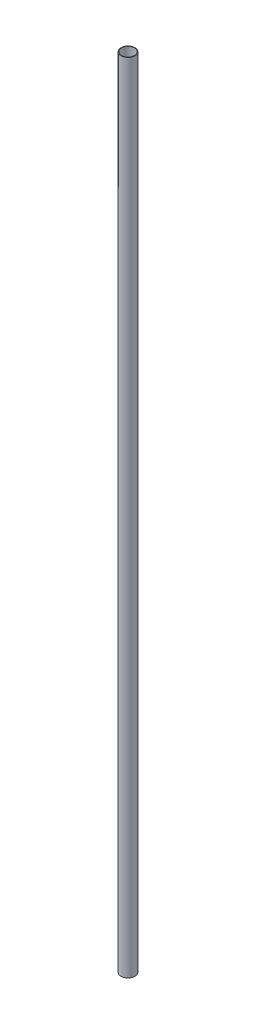
ISO-10303-21;
HEADER;
FILE_DESCRIPTION(('STEP AP214'),'2;1');
FILE_NAME('part.step','',(''),(''),'','','');
FILE_SCHEMA(('AUTOMOTIVE_DESIGN { 1 0 10303 214 1 1 1 1 }'));
ENDSEC;
DATA;
#1=APPLICATION_CONTEXT('core data for automotive mechanical design processes');
#2=APPLICATION_PROTOCOL_DEFINITION('international standard','automotive_design',2000,#1);
#3=PRODUCT_CONTEXT('',#1,'mechanical');
#4=PRODUCT('Part','Part','',(#3));
#5=PRODUCT_RELATED_PRODUCT_CATEGORY('part','',(#4));
#6=PRODUCT_DEFINITION_FORMATION('','',#4);
#7=PRODUCT_DEFINITION_CONTEXT('part definition',#1,'design');
#8=PRODUCT_DEFINITION('design','',#6,#7);
#9=PRODUCT_DEFINITION_SHAPE('','',#8);
#10=(LENGTH_UNIT() NAMED_UNIT(*) SI_UNIT(.MILLI.,.METRE.));
#11=(NAMED_UNIT(*) PLANE_ANGLE_UNIT() SI_UNIT($,.RADIAN.));
#12=(NAMED_UNIT(*) SI_UNIT($,.STERADIAN.) SOLID_ANGLE_UNIT());
#13=UNCERTAINTY_MEASURE_WITH_UNIT(LENGTH_MEASURE(1.E-05),#10,'distance_accuracy_value','');
#14=(GEOMETRIC_REPRESENTATION_CONTEXT(3) GLOBAL_UNCERTAINTY_ASSIGNED_CONTEXT((#13)) GLOBAL_UNIT_ASSIGNED_CONTEXT((#10,
#11,#12)) REPRESENTATION_CONTEXT('',''));
#15=CARTESIAN_POINT('',(0.,0.,0.));
#16=DIRECTION('',(0.,0.,1.));
#17=DIRECTION('',(1.,0.,0.));
#18=AXIS2_PLACEMENT_3D('',#15,#16,#17);
#19=CARTESIAN_POINT('',(0.,-857.,0.));
#20=DIRECTION('',(0.,1.,0.));
#21=DIRECTION('',(0.,0.,1.));
#22=AXIS2_PLACEMENT_3D('',#19,#20,#21);
#23=CYLINDRICAL_SURFACE('',#22,7.5);
#24=CARTESIAN_POINT('',(0.,-857.,0.));
#25=DIRECTION('',(0.,1.,0.));
#26=DIRECTION('',(0.,0.,1.));
#27=AXIS2_PLACEMENT_3D('',#24,#25,#26);
#28=CIRCLE('',#27,7.5);
#29=CARTESIAN_POINT('',(0.,-857.,7.5));
#30=VERTEX_POINT('',#29);
#31=EDGE_CURVE('E10',#30,#30,#28,.T.);
#32=ORIENTED_EDGE('',*,*,#31,.T.);
#33=EDGE_LOOP('',(#32));
#34=FACE_BOUND('',#33,.T.);
#35=CARTESIAN_POINT('',(0.,0.,0.));
#36=DIRECTION('',(0.,1.,0.));
#37=DIRECTION('',(0.,0.,1.));
#38=AXIS2_PLACEMENT_3D('',#35,#36,#37);
#39=CIRCLE('',#38,7.5);
#40=CARTESIAN_POINT('',(0.,0.,7.5));
#41=VERTEX_POINT('',#40);
#42=EDGE_CURVE('E33',#41,#41,#39,.T.);
#43=ORIENTED_EDGE('',*,*,#42,.F.);
#44=EDGE_LOOP('',(#43));
#45=FACE_BOUND('',#44,.T.);
#46=ADVANCED_FACE('F30',(#34,#45),#23,.T.);
#47=CARTESIAN_POINT('',(0.,-857.,0.));
#48=DIRECTION('',(0.,1.,0.));
#49=DIRECTION('',(0.,0.,1.));
#50=AXIS2_PLACEMENT_3D('',#47,#48,#49);
#51=PLANE('',#50);
#52=CARTESIAN_POINT('',(0.,-857.,0.));
#53=DIRECTION('',(0.,1.,0.));
#54=DIRECTION('',(0.,0.,1.));
#55=AXIS2_PLACEMENT_3D('',#52,#53,#54);
#56=CIRCLE('',#55,7.);
#57=CARTESIAN_POINT('',(0.,-857.,7.));
#58=VERTEX_POINT('',#57);
#59=EDGE_CURVE('E40',#58,#58,#56,.T.);
#60=ORIENTED_EDGE('',*,*,#59,.T.);
#61=EDGE_LOOP('',(#60));
#62=FACE_BOUND('',#61,.T.);
#63=ORIENTED_EDGE('',*,*,#31,.F.);
#64=EDGE_LOOP('',(#63));
#65=FACE_BOUND('',#64,.T.);
#66=ADVANCED_FACE('F48',(#62,#65),#51,.F.);
#67=CARTESIAN_POINT('',(0.,0.,0.));
#68=DIRECTION('',(0.,1.,0.));
#69=DIRECTION('',(0.,0.,1.));
#70=AXIS2_PLACEMENT_3D('',#67,#68,#69);
#71=PLANE('',#70);
#72=CARTESIAN_POINT('',(0.,0.,0.));
#73=DIRECTION('',(0.,1.,0.));
#74=DIRECTION('',(0.,0.,1.));
#75=AXIS2_PLACEMENT_3D('',#72,#73,#74);
#76=CIRCLE('',#75,7.);
#77=CARTESIAN_POINT('',(0.,0.,7.));
#78=VERTEX_POINT('',#77);
#79=EDGE_CURVE('E42',#78,#78,#76,.T.);
#80=ORIENTED_EDGE('',*,*,#79,.F.);
#81=EDGE_LOOP('',(#80));
#82=FACE_BOUND('',#81,.T.);
#83=ORIENTED_EDGE('',*,*,#42,.T.);
#84=EDGE_LOOP('',(#83));
#85=FACE_BOUND('',#84,.T.);
#86=ADVANCED_FACE('F54',(#82,#85),#71,.T.);
#87=CARTESIAN_POINT('',(0.,-857.,0.));
#88=DIRECTION('',(0.,1.,0.));
#89=DIRECTION('',(0.,0.,1.));
#90=AXIS2_PLACEMENT_3D('',#87,#88,#89);
#91=CYLINDRICAL_SURFACE('',#90,7.);
#92=ORIENTED_EDGE('',*,*,#59,.F.);
#93=EDGE_LOOP('',(#92));
#94=FACE_BOUND('',#93,.T.);
#95=ORIENTED_EDGE('',*,*,#79,.T.);
#96=EDGE_LOOP('',(#95));
#97=FACE_BOUND('',#96,.T.);
#98=ADVANCED_FACE('F51',(#94,#97),#91,.F.);
#99=CLOSED_SHELL('',(#46,#66,#86,#98));
#100=MANIFOLD_SOLID_BREP('B2',#99);
#101=ADVANCED_BREP_SHAPE_REPRESENTATION('',(#18,#100),#14);
#102=SHAPE_DEFINITION_REPRESENTATION(#9,#101);
ENDSEC;
END-ISO-10303-21;
